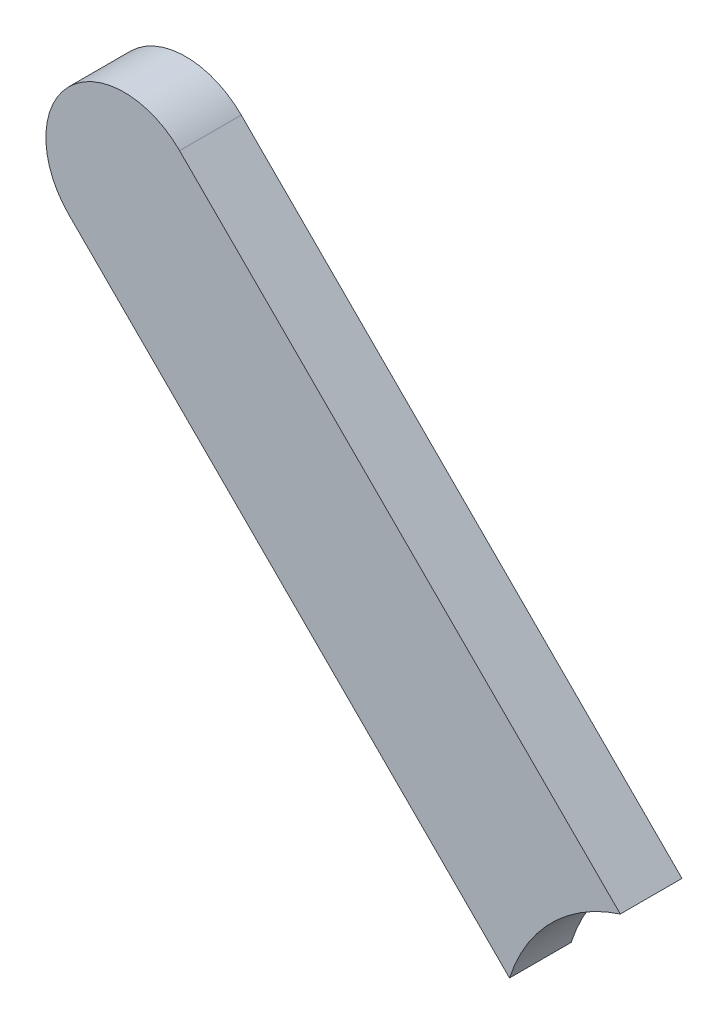
ISO-10303-21;
HEADER;
FILE_DESCRIPTION(('STEP AP214'),'2;1');
FILE_NAME('part.step','',(''),(''),'','','');
FILE_SCHEMA(('AUTOMOTIVE_DESIGN { 1 0 10303 214 1 1 1 1 }'));
ENDSEC;
DATA;
#1=APPLICATION_CONTEXT('core data for automotive mechanical design processes');
#2=APPLICATION_PROTOCOL_DEFINITION('international standard','automotive_design',2000,#1);
#3=PRODUCT_CONTEXT('',#1,'mechanical');
#4=PRODUCT('Part','Part','',(#3));
#5=PRODUCT_RELATED_PRODUCT_CATEGORY('part','',(#4));
#6=PRODUCT_DEFINITION_FORMATION('','',#4);
#7=PRODUCT_DEFINITION_CONTEXT('part definition',#1,'design');
#8=PRODUCT_DEFINITION('design','',#6,#7);
#9=PRODUCT_DEFINITION_SHAPE('','',#8);
#10=(LENGTH_UNIT() NAMED_UNIT(*) SI_UNIT(.MILLI.,.METRE.));
#11=(NAMED_UNIT(*) PLANE_ANGLE_UNIT() SI_UNIT($,.RADIAN.));
#12=(NAMED_UNIT(*) SI_UNIT($,.STERADIAN.) SOLID_ANGLE_UNIT());
#13=UNCERTAINTY_MEASURE_WITH_UNIT(LENGTH_MEASURE(1.E-05),#10,'distance_accuracy_value','');
#14=(GEOMETRIC_REPRESENTATION_CONTEXT(3) GLOBAL_UNCERTAINTY_ASSIGNED_CONTEXT((#13)) GLOBAL_UNIT_ASSIGNED_CONTEXT((#10,
#11,#12)) REPRESENTATION_CONTEXT('',''));
#15=CARTESIAN_POINT('',(0.,0.,0.));
#16=DIRECTION('',(0.,0.,1.));
#17=DIRECTION('',(1.,0.,0.));
#18=AXIS2_PLACEMENT_3D('',#15,#16,#17);
#19=CARTESIAN_POINT('',(107.13539406,87.4473994,0.));
#20=DIRECTION('',(0.707106781186542,0.707106781186553,0.));
#21=DIRECTION('',(0.707106781186553,-0.707106781186542,0.));
#22=AXIS2_PLACEMENT_3D('',#19,#20,#21);
#23=PLANE('',#22);
#24=DIRECTION('',(0.707106781186553,-0.707106781186542,0.));
#25=VECTOR('',#24,1.);
#26=CARTESIAN_POINT('',(107.13539406,87.4473994,0.1999996));
#27=LINE('',#26,#25);
#28=CARTESIAN_POINT('',(107.13539406,87.4473994,0.1999996));
#29=VERTEX_POINT('',#28);
#30=CARTESIAN_POINT('',(108.564461595153,86.0183318648469,0.1999996));
#31=VERTEX_POINT('',#30);
#32=EDGE_CURVE('E11',#29,#31,#27,.T.);
#33=ORIENTED_EDGE('',*,*,#32,.F.);
#34=DIRECTION('',(0.,0.,1.));
#35=VECTOR('',#34,1.);
#36=CARTESIAN_POINT('',(107.13539406,87.4473994,0.));
#37=LINE('',#36,#35);
#38=CARTESIAN_POINT('',(107.13539406,87.4473994,0.));
#39=VERTEX_POINT('',#38);
#40=EDGE_CURVE('E24',#39,#29,#37,.T.);
#41=ORIENTED_EDGE('',*,*,#40,.F.);
#42=DIRECTION('',(0.707106781186553,-0.707106781186542,0.));
#43=VECTOR('',#42,1.);
#44=CARTESIAN_POINT('',(107.13539406,87.4473994,0.));
#45=LINE('',#44,#43);
#46=CARTESIAN_POINT('',(108.564461595153,86.0183318648469,0.));
#47=VERTEX_POINT('',#46);
#48=EDGE_CURVE('E75',#39,#47,#45,.T.);
#49=ORIENTED_EDGE('',*,*,#48,.T.);
#50=DIRECTION('',(0.,0.,1.));
#51=VECTOR('',#50,1.);
#52=CARTESIAN_POINT('',(108.564461595153,86.0183318648469,0.));
#53=LINE('',#52,#51);
#54=EDGE_CURVE('E37',#47,#31,#53,.T.);
#55=ORIENTED_EDGE('',*,*,#54,.T.);
#56=EDGE_LOOP('',(#33,#41,#49,#55));
#57=FACE_BOUND('',#56,.T.);
#58=ADVANCED_FACE('F17',(#57),#23,.F.);
#59=CARTESIAN_POINT('',(109.093,85.8490028,0.));
#60=DIRECTION('',(0.,0.,-1.));
#61=DIRECTION('',(1.,0.,0.));
#62=AXIS2_PLACEMENT_3D('',#59,#60,#61);
#63=CYLINDRICAL_SURFACE('',#62,0.55500016);
#64=DIRECTION('',(0.,0.,1.));
#65=VECTOR('',#64,1.);
#66=CARTESIAN_POINT('',(108.923670935153,86.3775412048469,0.));
#67=LINE('',#66,#65);
#68=CARTESIAN_POINT('',(108.923670935153,86.3775412048469,0.));
#69=VERTEX_POINT('',#68);
#70=CARTESIAN_POINT('',(108.923670935153,86.3775412048469,0.1999996));
#71=VERTEX_POINT('',#70);
#72=EDGE_CURVE('E67',#69,#71,#67,.T.);
#73=ORIENTED_EDGE('',*,*,#72,.T.);
#74=CARTESIAN_POINT('',(109.093,85.8490028,0.1999996));
#75=DIRECTION('',(0.,0.,1.));
#76=DIRECTION('',(1.,0.,0.));
#77=AXIS2_PLACEMENT_3D('',#74,#75,#76);
#78=CIRCLE('',#77,0.55500016);
#79=EDGE_CURVE('E82',#71,#31,#78,.T.);
#80=ORIENTED_EDGE('',*,*,#79,.T.);
#81=ORIENTED_EDGE('',*,*,#54,.F.);
#82=CARTESIAN_POINT('',(109.093,85.8490028,0.));
#83=DIRECTION('',(0.,0.,1.));
#84=DIRECTION('',(1.,0.,0.));
#85=AXIS2_PLACEMENT_3D('',#82,#83,#84);
#86=CIRCLE('',#85,0.55500016);
#87=EDGE_CURVE('E80',#69,#47,#86,.T.);
#88=ORIENTED_EDGE('',*,*,#87,.F.);
#89=EDGE_LOOP('',(#73,#80,#81,#88));
#90=FACE_BOUND('',#89,.T.);
#91=ADVANCED_FACE('F88',(#90),#63,.F.);
#92=CARTESIAN_POINT('',(108.923670935153,86.3775412048469,0.));
#93=DIRECTION('',(-0.70710678118655,-0.707106781186545,0.));
#94=DIRECTION('',(-0.707106781186545,0.70710678118655,0.));
#95=AXIS2_PLACEMENT_3D('',#92,#93,#94);
#96=PLANE('',#95);
#97=DIRECTION('',(-0.707106781186545,0.70710678118655,0.));
#98=VECTOR('',#97,1.);
#99=CARTESIAN_POINT('',(109.27260594,86.0286062,0.1999996));
#100=LINE('',#99,#98);
#101=CARTESIAN_POINT('',(107.4946034,87.80660874,0.1999996));
#102=VERTEX_POINT('',#101);
#103=EDGE_CURVE('E71',#71,#102,#100,.T.);
#104=ORIENTED_EDGE('',*,*,#103,.F.);
#105=ORIENTED_EDGE('',*,*,#72,.F.);
#106=DIRECTION('',(-0.707106781186545,0.70710678118655,0.));
#107=VECTOR('',#106,1.);
#108=CARTESIAN_POINT('',(109.27260594,86.0286062,0.));
#109=LINE('',#108,#107);
#110=CARTESIAN_POINT('',(107.4946034,87.80660874,0.));
#111=VERTEX_POINT('',#110);
#112=EDGE_CURVE('E63',#69,#111,#109,.T.);
#113=ORIENTED_EDGE('',*,*,#112,.T.);
#114=DIRECTION('',(0.,0.,1.));
#115=VECTOR('',#114,1.);
#116=CARTESIAN_POINT('',(107.4946034,87.80660874,0.));
#117=LINE('',#116,#115);
#118=EDGE_CURVE('E53',#111,#102,#117,.T.);
#119=ORIENTED_EDGE('',*,*,#118,.T.);
#120=EDGE_LOOP('',(#104,#105,#113,#119));
#121=FACE_BOUND('',#120,.T.);
#122=ADVANCED_FACE('F66',(#121),#96,.F.);
#123=CARTESIAN_POINT('',(107.31499873,87.62700407,0.));
#124=DIRECTION('',(0.,0.,-1.));
#125=DIRECTION('',(0.707106781186576,0.70710678118652,0.));
#126=AXIS2_PLACEMENT_3D('',#123,#124,#125);
#127=CYLINDRICAL_SURFACE('',#126,0.253999360179552);
#128=CARTESIAN_POINT('',(107.31499873,87.62700407,0.1999996));
#129=DIRECTION('',(0.,0.,1.));
#130=DIRECTION('',(0.707106781186576,0.70710678118652,0.));
#131=AXIS2_PLACEMENT_3D('',#128,#129,#130);
#132=CIRCLE('',#131,0.253999360179552);
#133=EDGE_CURVE('E59',#102,#29,#132,.T.);
#134=ORIENTED_EDGE('',*,*,#133,.F.);
#135=ORIENTED_EDGE('',*,*,#118,.F.);
#136=CARTESIAN_POINT('',(107.31499873,87.62700407,0.));
#137=DIRECTION('',(0.,0.,1.));
#138=DIRECTION('',(0.707106781186576,0.70710678118652,0.));
#139=AXIS2_PLACEMENT_3D('',#136,#137,#138);
#140=CIRCLE('',#139,0.253999360179552);
#141=EDGE_CURVE('E57',#111,#39,#140,.T.);
#142=ORIENTED_EDGE('',*,*,#141,.T.);
#143=ORIENTED_EDGE('',*,*,#40,.T.);
#144=EDGE_LOOP('',(#134,#135,#142,#143));
#145=FACE_BOUND('',#144,.T.);
#146=ADVANCED_FACE('F55',(#145),#127,.T.);
#147=CARTESIAN_POINT('',(107.13539406,87.4473994,0.));
#148=DIRECTION('',(0.,0.,-1.));
#149=DIRECTION('',(-1.,0.,0.));
#150=AXIS2_PLACEMENT_3D('',#147,#148,#149);
#151=PLANE('',#150);
#152=ORIENTED_EDGE('',*,*,#48,.F.);
#153=ORIENTED_EDGE('',*,*,#141,.F.);
#154=ORIENTED_EDGE('',*,*,#112,.F.);
#155=ORIENTED_EDGE('',*,*,#87,.T.);
#156=EDGE_LOOP('',(#152,#153,#154,#155));
#157=FACE_BOUND('',#156,.T.);
#158=ADVANCED_FACE('F74',(#157),#151,.T.);
#159=CARTESIAN_POINT('',(107.13539406,87.4473994,0.1999996));
#160=DIRECTION('',(0.,0.,-1.));
#161=DIRECTION('',(-1.,0.,0.));
#162=AXIS2_PLACEMENT_3D('',#159,#160,#161);
#163=PLANE('',#162);
#164=ORIENTED_EDGE('',*,*,#133,.T.);
#165=ORIENTED_EDGE('',*,*,#32,.T.);
#166=ORIENTED_EDGE('',*,*,#79,.F.);
#167=ORIENTED_EDGE('',*,*,#103,.T.);
#168=EDGE_LOOP('',(#164,#165,#166,#167));
#169=FACE_BOUND('',#168,.T.);
#170=ADVANCED_FACE('F91',(#169),#163,.F.);
#171=CLOSED_SHELL('',(#58,#91,#122,#146,#158,#170));
#172=MANIFOLD_SOLID_BREP('B1',#171);
#173=ADVANCED_BREP_SHAPE_REPRESENTATION('',(#18,#172),#14);
#174=SHAPE_DEFINITION_REPRESENTATION(#9,#173);
ENDSEC;
END-ISO-10303-21;
